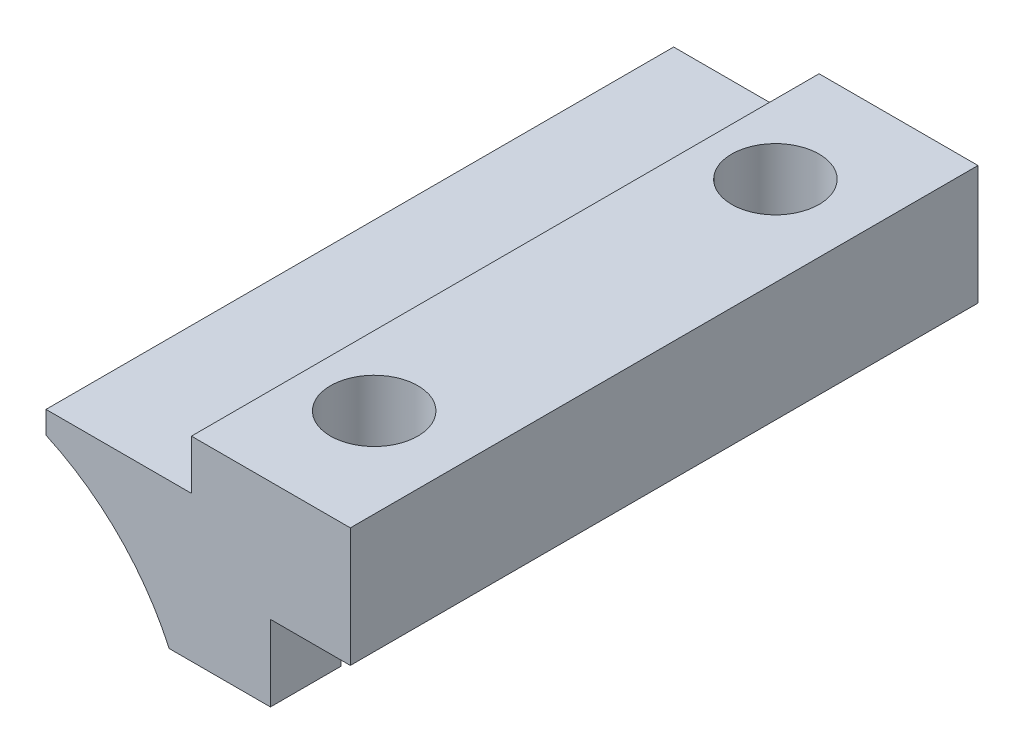
ISO-10303-21;
HEADER;
FILE_DESCRIPTION(('STEP AP214'),'2;1');
FILE_NAME('part.step','',(''),(''),'','','');
FILE_SCHEMA(('AUTOMOTIVE_DESIGN { 1 0 10303 214 1 1 1 1 }'));
ENDSEC;
DATA;
#1=APPLICATION_CONTEXT('core data for automotive mechanical design processes');
#2=APPLICATION_PROTOCOL_DEFINITION('international standard','automotive_design',2000,#1);
#3=PRODUCT_CONTEXT('',#1,'mechanical');
#4=PRODUCT('Part','Part','',(#3));
#5=PRODUCT_RELATED_PRODUCT_CATEGORY('part','',(#4));
#6=PRODUCT_DEFINITION_FORMATION('','',#4);
#7=PRODUCT_DEFINITION_CONTEXT('part definition',#1,'design');
#8=PRODUCT_DEFINITION('design','',#6,#7);
#9=PRODUCT_DEFINITION_SHAPE('','',#8);
#10=(LENGTH_UNIT() NAMED_UNIT(*) SI_UNIT(.MILLI.,.METRE.));
#11=(NAMED_UNIT(*) PLANE_ANGLE_UNIT() SI_UNIT($,.RADIAN.));
#12=(NAMED_UNIT(*) SI_UNIT($,.STERADIAN.) SOLID_ANGLE_UNIT());
#13=UNCERTAINTY_MEASURE_WITH_UNIT(LENGTH_MEASURE(1.E-05),#10,'distance_accuracy_value','');
#14=(GEOMETRIC_REPRESENTATION_CONTEXT(3) GLOBAL_UNCERTAINTY_ASSIGNED_CONTEXT((#13)) GLOBAL_UNIT_ASSIGNED_CONTEXT((#10,
#11,#12)) REPRESENTATION_CONTEXT('',''));
#15=CARTESIAN_POINT('',(0.,0.,0.));
#16=DIRECTION('',(0.,0.,1.));
#17=DIRECTION('',(1.,0.,0.));
#18=AXIS2_PLACEMENT_3D('',#15,#16,#17);
#19=CARTESIAN_POINT('',(12.5,6.25,-31.5));
#20=DIRECTION('',(-1.,0.,0.));
#21=DIRECTION('',(0.,0.,1.));
#22=AXIS2_PLACEMENT_3D('',#19,#20,#21);
#23=PLANE('',#22);
#24=DIRECTION('',(0.,0.,-1.));
#25=VECTOR('',#24,1.);
#26=CARTESIAN_POINT('',(12.5,12.5047262531089,-31.5));
#27=LINE('',#26,#25);
#28=CARTESIAN_POINT('',(12.5,12.5047262531089,0.600000000000004));
#29=VERTEX_POINT('',#28);
#30=CARTESIAN_POINT('',(12.5,12.5047262531089,-31.));
#31=VERTEX_POINT('',#30);
#32=EDGE_CURVE('E231',#29,#31,#27,.T.);
#33=ORIENTED_EDGE('',*,*,#32,.F.);
#34=DIRECTION('',(0.,1.,0.));
#35=VECTOR('',#34,1.);
#36=CARTESIAN_POINT('',(12.5,6.25,0.600000000000003));
#37=LINE('',#36,#35);
#38=CARTESIAN_POINT('',(12.5,15.,0.600000000000001));
#39=VERTEX_POINT('',#38);
#40=EDGE_CURVE('E209',#29,#39,#37,.T.);
#41=ORIENTED_EDGE('',*,*,#40,.T.);
#42=DIRECTION('',(0.,0.,1.));
#43=VECTOR('',#42,1.);
#44=CARTESIAN_POINT('',(12.5,15.,-31.5));
#45=LINE('',#44,#43);
#46=CARTESIAN_POINT('',(12.5,15.,-31.));
#47=VERTEX_POINT('',#46);
#48=EDGE_CURVE('E273',#47,#39,#45,.T.);
#49=ORIENTED_EDGE('',*,*,#48,.F.);
#50=DIRECTION('',(0.,1.,0.));
#51=VECTOR('',#50,1.);
#52=CARTESIAN_POINT('',(12.5,6.25,-31.));
#53=LINE('',#52,#51);
#54=EDGE_CURVE('E198',#31,#47,#53,.T.);
#55=ORIENTED_EDGE('',*,*,#54,.F.);
#56=EDGE_LOOP('',(#33,#41,#49,#55));
#57=FACE_BOUND('',#56,.T.);
#58=ADVANCED_FACE('F50',(#57),#23,.T.);
#59=CARTESIAN_POINT('',(20.5,6.25,-1.5));
#60=DIRECTION('',(1.,0.,0.));
#61=DIRECTION('',(0.,0.,-1.));
#62=AXIS2_PLACEMENT_3D('',#59,#60,#61);
#63=PLANE('',#62);
#64=DIRECTION('',(0.,0.,1.));
#65=VECTOR('',#64,1.);
#66=CARTESIAN_POINT('',(20.5,9.,-31.001));
#67=LINE('',#66,#65);
#68=CARTESIAN_POINT('',(20.5,9.,-31.));
#69=VERTEX_POINT('',#68);
#70=CARTESIAN_POINT('',(20.5,9.,0.599999999999999));
#71=VERTEX_POINT('',#70);
#72=EDGE_CURVE('E144',#69,#71,#67,.T.);
#73=ORIENTED_EDGE('',*,*,#72,.F.);
#74=DIRECTION('',(0.,1.,0.));
#75=VECTOR('',#74,1.);
#76=CARTESIAN_POINT('',(20.5,0.,-31.));
#77=LINE('',#76,#75);
#78=CARTESIAN_POINT('',(20.5,15.,-31.));
#79=VERTEX_POINT('',#78);
#80=EDGE_CURVE('E175',#69,#79,#77,.T.);
#81=ORIENTED_EDGE('',*,*,#80,.T.);
#82=DIRECTION('',(0.,0.,-1.));
#83=VECTOR('',#82,1.);
#84=CARTESIAN_POINT('',(20.5,15.,-1.5));
#85=LINE('',#84,#83);
#86=CARTESIAN_POINT('',(20.5,15.,0.600000000000002));
#87=VERTEX_POINT('',#86);
#88=EDGE_CURVE('E168',#87,#79,#85,.T.);
#89=ORIENTED_EDGE('',*,*,#88,.F.);
#90=DIRECTION('',(0.,1.,0.));
#91=VECTOR('',#90,1.);
#92=CARTESIAN_POINT('',(20.5,0.,0.600000000000002));
#93=LINE('',#92,#91);
#94=EDGE_CURVE('E159',#71,#87,#93,.T.);
#95=ORIENTED_EDGE('',*,*,#94,.F.);
#96=EDGE_LOOP('',(#73,#81,#89,#95));
#97=FACE_BOUND('',#96,.T.);
#98=ADVANCED_FACE('F166',(#97),#63,.T.);
#99=CARTESIAN_POINT('',(0.,15.,0.));
#100=DIRECTION('',(0.,1.,0.));
#101=DIRECTION('',(0.,0.,1.));
#102=AXIS2_PLACEMENT_3D('',#99,#100,#101);
#103=PLANE('',#102);
#104=CARTESIAN_POINT('',(16.,15.,-5.10000984037937));
#105=DIRECTION('',(0.,1.,0.));
#106=DIRECTION('',(0.,0.,1.));
#107=AXIS2_PLACEMENT_3D('',#104,#105,#106);
#108=CIRCLE('',#107,2.2);
#109=CARTESIAN_POINT('',(16.,15.,-2.90000984037937));
#110=VERTEX_POINT('',#109);
#111=EDGE_CURVE('E187',#110,#110,#108,.T.);
#112=ORIENTED_EDGE('',*,*,#111,.F.);
#113=EDGE_LOOP('',(#112));
#114=FACE_BOUND('',#113,.T.);
#115=CARTESIAN_POINT('',(16.,15.,-25.3));
#116=DIRECTION('',(0.,1.,0.));
#117=DIRECTION('',(0.,0.,1.));
#118=AXIS2_PLACEMENT_3D('',#115,#116,#117);
#119=CIRCLE('',#118,2.2);
#120=CARTESIAN_POINT('',(16.,15.,-23.1));
#121=VERTEX_POINT('',#120);
#122=EDGE_CURVE('E182',#121,#121,#119,.T.);
#123=ORIENTED_EDGE('',*,*,#122,.F.);
#124=EDGE_LOOP('',(#123));
#125=FACE_BOUND('',#124,.T.);
#126=ORIENTED_EDGE('',*,*,#48,.T.);
#127=DIRECTION('',(1.,0.,0.));
#128=VECTOR('',#127,1.);
#129=CARTESIAN_POINT('',(5.17766952966376,15.,0.6));
#130=LINE('',#129,#128);
#131=EDGE_CURVE('E170',#39,#87,#130,.T.);
#132=ORIENTED_EDGE('',*,*,#131,.T.);
#133=ORIENTED_EDGE('',*,*,#88,.T.);
#134=DIRECTION('',(1.,0.,0.));
#135=VECTOR('',#134,1.);
#136=CARTESIAN_POINT('',(5.17766952966376,15.,-31.));
#137=LINE('',#136,#135);
#138=EDGE_CURVE('E336',#47,#79,#137,.T.);
#139=ORIENTED_EDGE('',*,*,#138,.F.);
#140=EDGE_LOOP('',(#126,#132,#133,#139));
#141=FACE_BOUND('',#140,.T.);
#142=ADVANCED_FACE('F351',(#114,#125,#141),#103,.T.);
#143=CARTESIAN_POINT('',(16.4772465140557,5.17766952966369,-1.5));
#144=DIRECTION('',(-1.,0.,0.));
#145=DIRECTION('',(0.,0.,1.));
#146=AXIS2_PLACEMENT_3D('',#143,#144,#145);
#147=PLANE('',#146);
#148=DIRECTION('',(0.,1.,0.));
#149=VECTOR('',#148,1.);
#150=CARTESIAN_POINT('',(16.4772465140557,5.17766952966369,0.600000000000001));
#151=LINE('',#150,#149);
#152=CARTESIAN_POINT('',(16.4772465140557,5.17766952966369,0.600000000000001));
#153=VERTEX_POINT('',#152);
#154=CARTESIAN_POINT('',(16.4772465140557,9.,0.599999999999999));
#155=VERTEX_POINT('',#154);
#156=EDGE_CURVE('E162',#153,#155,#151,.T.);
#157=ORIENTED_EDGE('',*,*,#156,.F.);
#158=DIRECTION('',(0.,0.,1.));
#159=VECTOR('',#158,1.);
#160=CARTESIAN_POINT('',(16.4772465140557,5.17766952966369,-1.5));
#161=LINE('',#160,#159);
#162=CARTESIAN_POINT('',(16.4772465140557,5.17766952966369,-2.95239819838688));
#163=VERTEX_POINT('',#162);
#164=EDGE_CURVE('E239',#163,#153,#161,.T.);
#165=ORIENTED_EDGE('',*,*,#164,.F.);
#166=DIRECTION('',(0.,1.,0.));
#167=VECTOR('',#166,1.);
#168=CARTESIAN_POINT('',(16.4772465140557,0.,-2.95239819838688));
#169=LINE('',#168,#167);
#170=CARTESIAN_POINT('',(16.4772465140557,9.,-2.95239819838688));
#171=VERTEX_POINT('',#170);
#172=EDGE_CURVE('E65',#163,#171,#169,.T.);
#173=ORIENTED_EDGE('',*,*,#172,.T.);
#174=DIRECTION('',(0.,0.,1.));
#175=VECTOR('',#174,1.);
#176=CARTESIAN_POINT('',(16.4772465140557,9.,-31.001));
#177=LINE('',#176,#175);
#178=EDGE_CURVE('E155',#171,#155,#177,.T.);
#179=ORIENTED_EDGE('',*,*,#178,.T.);
#180=EDGE_LOOP('',(#157,#165,#173,#179));
#181=FACE_BOUND('',#180,.T.);
#182=ADVANCED_FACE('F307',(#181),#147,.F.);
#183=DIRECTION('',(0.,1.,0.));
#184=VECTOR('',#183,1.);
#185=CARTESIAN_POINT('',(16.4772465140557,0.,-23.1523883580075));
#186=LINE('',#185,#184);
#187=CARTESIAN_POINT('',(16.4772465140557,5.17766952966369,-23.1523883580075));
#188=VERTEX_POINT('',#187);
#189=CARTESIAN_POINT('',(16.4772465140557,9.,-23.1523883580075));
#190=VERTEX_POINT('',#189);
#191=EDGE_CURVE('E217',#188,#190,#186,.T.);
#192=ORIENTED_EDGE('',*,*,#191,.T.);
#193=CARTESIAN_POINT('',(16.4772465140557,9.,-7.24762148237187));
#194=VERTEX_POINT('',#193);
#195=EDGE_CURVE('E310',#190,#194,#177,.T.);
#196=ORIENTED_EDGE('',*,*,#195,.T.);
#197=DIRECTION('',(0.,1.,0.));
#198=VECTOR('',#197,1.);
#199=CARTESIAN_POINT('',(16.4772465140557,0.,-7.24762148237187));
#200=LINE('',#199,#198);
#201=CARTESIAN_POINT('',(16.4772465140557,5.17766952966369,-7.24762148237187));
#202=VERTEX_POINT('',#201);
#203=EDGE_CURVE('E220',#194,#202,#200,.F.);
#204=ORIENTED_EDGE('',*,*,#203,.T.);
#205=EDGE_CURVE('E295',#188,#202,#161,.T.);
#206=ORIENTED_EDGE('',*,*,#205,.F.);
#207=EDGE_LOOP('',(#192,#196,#204,#206));
#208=FACE_BOUND('',#207,.T.);
#209=ADVANCED_FACE('F299',(#208),#147,.F.);
#210=CARTESIAN_POINT('',(0.,5.17766952966369,0.));
#211=DIRECTION('',(0.,1.,0.));
#212=DIRECTION('',(0.,0.,1.));
#213=AXIS2_PLACEMENT_3D('',#210,#211,#212);
#214=PLANE('',#213);
#215=DIRECTION('',(1.,0.,0.));
#216=VECTOR('',#215,1.);
#217=CARTESIAN_POINT('',(0.,5.17766952966369,0.599999999999999));
#218=LINE('',#217,#216);
#219=CARTESIAN_POINT('',(11.3772465140557,5.17766952966368,0.600000000000005));
#220=VERTEX_POINT('',#219);
#221=EDGE_CURVE('E201',#220,#153,#218,.T.);
#222=ORIENTED_EDGE('',*,*,#221,.F.);
#223=DIRECTION('',(0.,0.,1.));
#224=VECTOR('',#223,1.);
#225=CARTESIAN_POINT('',(11.3772465140557,5.17766952966369,-31.5));
#226=LINE('',#225,#224);
#227=CARTESIAN_POINT('',(11.3772465140557,5.17766952966369,-31.));
#228=VERTEX_POINT('',#227);
#229=EDGE_CURVE('E226',#228,#220,#226,.T.);
#230=ORIENTED_EDGE('',*,*,#229,.F.);
#231=DIRECTION('',(1.,0.,0.));
#232=VECTOR('',#231,1.);
#233=CARTESIAN_POINT('',(0.,5.17766952966369,-31.));
#234=LINE('',#233,#232);
#235=CARTESIAN_POINT('',(16.4772465140557,5.17766952966369,-31.));
#236=VERTEX_POINT('',#235);
#237=EDGE_CURVE('E186',#228,#236,#234,.T.);
#238=ORIENTED_EDGE('',*,*,#237,.T.);
#239=CARTESIAN_POINT('',(16.4772465140557,5.17766952966369,-27.4476116419925));
#240=VERTEX_POINT('',#239);
#241=EDGE_CURVE('E278',#236,#240,#161,.T.);
#242=ORIENTED_EDGE('',*,*,#241,.T.);
#243=CARTESIAN_POINT('',(16.,5.17766952966369,-25.3));
#244=DIRECTION('',(0.,1.,0.));
#245=DIRECTION('',(0.,0.,1.));
#246=AXIS2_PLACEMENT_3D('',#243,#244,#245);
#247=CIRCLE('',#246,2.2);
#248=EDGE_CURVE('E58',#240,#188,#247,.T.);
#249=ORIENTED_EDGE('',*,*,#248,.T.);
#250=ORIENTED_EDGE('',*,*,#205,.T.);
#251=CARTESIAN_POINT('',(16.,5.17766952966369,-5.10000984037937));
#252=DIRECTION('',(0.,1.,0.));
#253=DIRECTION('',(0.,0.,1.));
#254=AXIS2_PLACEMENT_3D('',#251,#252,#253);
#255=CIRCLE('',#254,2.2);
#256=EDGE_CURVE('E12',#202,#163,#255,.T.);
#257=ORIENTED_EDGE('',*,*,#256,.T.);
#258=ORIENTED_EDGE('',*,*,#164,.T.);
#259=EDGE_LOOP('',(#222,#230,#238,#242,#249,#250,#257,#258));
#260=FACE_BOUND('',#259,.T.);
#261=ADVANCED_FACE('F294',(#260),#214,.F.);
#262=CARTESIAN_POINT('',(5.17766952966376,12.5047262531089,-31.5));
#263=DIRECTION('',(0.,-1.,0.));
#264=DIRECTION('',(0.,0.,-1.));
#265=AXIS2_PLACEMENT_3D('',#262,#263,#264);
#266=PLANE('',#265);
#267=DIRECTION('',(-1.,0.,0.));
#268=VECTOR('',#267,1.);
#269=CARTESIAN_POINT('',(5.17766952966376,12.5047262531089,0.600000000000003));
#270=LINE('',#269,#268);
#271=CARTESIAN_POINT('',(5.17766952966376,12.5047262531089,0.6));
#272=VERTEX_POINT('',#271);
#273=EDGE_CURVE('E206',#29,#272,#270,.T.);
#274=ORIENTED_EDGE('',*,*,#273,.F.);
#275=ORIENTED_EDGE('',*,*,#32,.T.);
#276=DIRECTION('',(-1.,0.,0.));
#277=VECTOR('',#276,1.);
#278=CARTESIAN_POINT('',(5.17766952966376,12.5047262531089,-31.));
#279=LINE('',#278,#277);
#280=CARTESIAN_POINT('',(5.17766952966376,12.5047262531089,-31.));
#281=VERTEX_POINT('',#280);
#282=EDGE_CURVE('E194',#31,#281,#279,.T.);
#283=ORIENTED_EDGE('',*,*,#282,.T.);
#284=DIRECTION('',(0.,0.,-1.));
#285=VECTOR('',#284,1.);
#286=CARTESIAN_POINT('',(5.17766952966376,12.5047262531089,-31.5));
#287=LINE('',#286,#285);
#288=EDGE_CURVE('E235',#272,#281,#287,.T.);
#289=ORIENTED_EDGE('',*,*,#288,.F.);
#290=EDGE_LOOP('',(#274,#275,#283,#289));
#291=FACE_BOUND('',#290,.T.);
#292=ADVANCED_FACE('F356',(#291),#266,.F.);
#293=CARTESIAN_POINT('',(5.17766952966376,0.,0.));
#294=DIRECTION('',(1.,0.,0.));
#295=DIRECTION('',(0.,0.,-1.));
#296=AXIS2_PLACEMENT_3D('',#293,#294,#295);
#297=PLANE('',#296);
#298=DIRECTION('',(0.,1.,0.));
#299=VECTOR('',#298,1.);
#300=CARTESIAN_POINT('',(5.17766952966376,0.,0.6));
#301=LINE('',#300,#299);
#302=CARTESIAN_POINT('',(5.17766952966374,11.3772465140557,0.600000000000003));
#303=VERTEX_POINT('',#302);
#304=EDGE_CURVE('E171',#303,#272,#301,.T.);
#305=ORIENTED_EDGE('',*,*,#304,.T.);
#306=ORIENTED_EDGE('',*,*,#288,.T.);
#307=DIRECTION('',(0.,1.,0.));
#308=VECTOR('',#307,1.);
#309=CARTESIAN_POINT('',(5.17766952966376,0.,-31.));
#310=LINE('',#309,#308);
#311=CARTESIAN_POINT('',(5.17766952966376,11.3772465140557,-31.));
#312=VERTEX_POINT('',#311);
#313=EDGE_CURVE('E340',#312,#281,#310,.T.);
#314=ORIENTED_EDGE('',*,*,#313,.F.);
#315=DIRECTION('',(0.,0.,1.));
#316=VECTOR('',#315,1.);
#317=CARTESIAN_POINT('',(5.17766952966374,11.3772465140557,-31.5));
#318=LINE('',#317,#316);
#319=EDGE_CURVE('E227',#312,#303,#318,.T.);
#320=ORIENTED_EDGE('',*,*,#319,.T.);
#321=EDGE_LOOP('',(#305,#306,#314,#320));
#322=FACE_BOUND('',#321,.T.);
#323=ADVANCED_FACE('F360',(#322),#297,.F.);
#324=CARTESIAN_POINT('',(0.,0.,-31.5));
#325=DIRECTION('',(0.,0.,1.));
#326=DIRECTION('',(1.,0.,0.));
#327=AXIS2_PLACEMENT_3D('',#324,#325,#326);
#328=CYLINDRICAL_SURFACE('',#327,12.5);
#329=CARTESIAN_POINT('',(0.,0.,0.600000000000003));
#330=DIRECTION('',(0.,0.,1.));
#331=DIRECTION('',(1.,0.,0.));
#332=AXIS2_PLACEMENT_3D('',#329,#330,#331);
#333=CIRCLE('',#332,12.5);
#334=EDGE_CURVE('E285',#303,#220,#333,.F.);
#335=ORIENTED_EDGE('',*,*,#334,.F.);
#336=ORIENTED_EDGE('',*,*,#319,.F.);
#337=CARTESIAN_POINT('',(0.,0.,-31.));
#338=DIRECTION('',(0.,0.,1.));
#339=DIRECTION('',(1.,0.,0.));
#340=AXIS2_PLACEMENT_3D('',#337,#338,#339);
#341=CIRCLE('',#340,12.5);
#342=EDGE_CURVE('E281',#312,#228,#341,.F.);
#343=ORIENTED_EDGE('',*,*,#342,.T.);
#344=ORIENTED_EDGE('',*,*,#229,.T.);
#345=EDGE_LOOP('',(#335,#336,#343,#344));
#346=FACE_BOUND('',#345,.T.);
#347=ADVANCED_FACE('F364',(#346),#328,.F.);
#348=ORIENTED_EDGE('',*,*,#241,.F.);
#349=DIRECTION('',(0.,1.,0.));
#350=VECTOR('',#349,1.);
#351=CARTESIAN_POINT('',(16.4772465140557,5.17766952966369,-31.));
#352=LINE('',#351,#350);
#353=CARTESIAN_POINT('',(16.4772465140557,9.,-31.));
#354=VERTEX_POINT('',#353);
#355=EDGE_CURVE('E191',#236,#354,#352,.T.);
#356=ORIENTED_EDGE('',*,*,#355,.T.);
#357=CARTESIAN_POINT('',(16.4772465140557,9.,-27.4476116419925));
#358=VERTEX_POINT('',#357);
#359=EDGE_CURVE('E178',#354,#358,#177,.T.);
#360=ORIENTED_EDGE('',*,*,#359,.T.);
#361=DIRECTION('',(0.,1.,0.));
#362=VECTOR('',#361,1.);
#363=CARTESIAN_POINT('',(16.4772465140557,0.,-27.4476116419925));
#364=LINE('',#363,#362);
#365=EDGE_CURVE('E213',#358,#240,#364,.F.);
#366=ORIENTED_EDGE('',*,*,#365,.T.);
#367=EDGE_LOOP('',(#348,#356,#360,#366));
#368=FACE_BOUND('',#367,.T.);
#369=ADVANCED_FACE('F317',(#368),#147,.F.);
#370=CARTESIAN_POINT('',(5.17766952966376,0.,-31.));
#371=DIRECTION('',(0.,0.,1.));
#372=DIRECTION('',(1.,0.,0.));
#373=AXIS2_PLACEMENT_3D('',#370,#371,#372);
#374=PLANE('',#373);
#375=DIRECTION('',(1.,0.,0.));
#376=VECTOR('',#375,1.);
#377=CARTESIAN_POINT('',(16.4772465140557,9.,-31.));
#378=LINE('',#377,#376);
#379=EDGE_CURVE('E150',#354,#69,#378,.T.);
#380=ORIENTED_EDGE('',*,*,#379,.F.);
#381=ORIENTED_EDGE('',*,*,#355,.F.);
#382=ORIENTED_EDGE('',*,*,#237,.F.);
#383=ORIENTED_EDGE('',*,*,#342,.F.);
#384=ORIENTED_EDGE('',*,*,#313,.T.);
#385=ORIENTED_EDGE('',*,*,#282,.F.);
#386=ORIENTED_EDGE('',*,*,#54,.T.);
#387=ORIENTED_EDGE('',*,*,#138,.T.);
#388=ORIENTED_EDGE('',*,*,#80,.F.);
#389=EDGE_LOOP('',(#380,#381,#382,#383,#384,#385,#386,#387,#388));
#390=FACE_BOUND('',#389,.T.);
#391=ADVANCED_FACE('F347',(#390),#374,.F.);
#392=CARTESIAN_POINT('',(5.17766952966376,0.,0.6));
#393=DIRECTION('',(0.,0.,1.));
#394=DIRECTION('',(1.,0.,0.));
#395=AXIS2_PLACEMENT_3D('',#392,#393,#394);
#396=PLANE('',#395);
#397=ORIENTED_EDGE('',*,*,#156,.T.);
#398=DIRECTION('',(-1.,0.,0.));
#399=VECTOR('',#398,1.);
#400=CARTESIAN_POINT('',(16.4772465140557,9.,0.599999999999999));
#401=LINE('',#400,#399);
#402=EDGE_CURVE('E147',#71,#155,#401,.T.);
#403=ORIENTED_EDGE('',*,*,#402,.F.);
#404=ORIENTED_EDGE('',*,*,#94,.T.);
#405=ORIENTED_EDGE('',*,*,#131,.F.);
#406=ORIENTED_EDGE('',*,*,#40,.F.);
#407=ORIENTED_EDGE('',*,*,#273,.T.);
#408=ORIENTED_EDGE('',*,*,#304,.F.);
#409=ORIENTED_EDGE('',*,*,#334,.T.);
#410=ORIENTED_EDGE('',*,*,#221,.T.);
#411=EDGE_LOOP('',(#397,#403,#404,#405,#406,#407,#408,#409,#410));
#412=FACE_BOUND('',#411,.T.);
#413=ADVANCED_FACE('F158',(#412),#396,.T.);
#414=CARTESIAN_POINT('',(16.,0.,-25.3));
#415=DIRECTION('',(0.,1.,0.));
#416=DIRECTION('',(0.,0.,1.));
#417=AXIS2_PLACEMENT_3D('',#414,#415,#416);
#418=CYLINDRICAL_SURFACE('',#417,2.2);
#419=ORIENTED_EDGE('',*,*,#365,.F.);
#420=CARTESIAN_POINT('',(16.,9.,-25.3));
#421=DIRECTION('',(0.,1.,0.));
#422=DIRECTION('',(0.,0.,1.));
#423=AXIS2_PLACEMENT_3D('',#420,#421,#422);
#424=CIRCLE('',#423,2.2);
#425=EDGE_CURVE('E319',#190,#358,#424,.T.);
#426=ORIENTED_EDGE('',*,*,#425,.F.);
#427=ORIENTED_EDGE('',*,*,#191,.F.);
#428=ORIENTED_EDGE('',*,*,#248,.F.);
#429=EDGE_LOOP('',(#419,#426,#427,#428));
#430=FACE_BOUND('',#429,.T.);
#431=ORIENTED_EDGE('',*,*,#122,.T.);
#432=EDGE_LOOP('',(#431));
#433=FACE_BOUND('',#432,.T.);
#434=ADVANCED_FACE('F330',(#430,#433),#418,.F.);
#435=CARTESIAN_POINT('',(16.,0.,-5.10000984037937));
#436=DIRECTION('',(0.,1.,0.));
#437=DIRECTION('',(0.,0.,1.));
#438=AXIS2_PLACEMENT_3D('',#435,#436,#437);
#439=CYLINDRICAL_SURFACE('',#438,2.2);
#440=ORIENTED_EDGE('',*,*,#203,.F.);
#441=CARTESIAN_POINT('',(16.,9.,-5.10000984037937));
#442=DIRECTION('',(0.,1.,0.));
#443=DIRECTION('',(0.,0.,1.));
#444=AXIS2_PLACEMENT_3D('',#441,#442,#443);
#445=CIRCLE('',#444,2.2);
#446=EDGE_CURVE('E321',#171,#194,#445,.T.);
#447=ORIENTED_EDGE('',*,*,#446,.F.);
#448=ORIENTED_EDGE('',*,*,#172,.F.);
#449=ORIENTED_EDGE('',*,*,#256,.F.);
#450=EDGE_LOOP('',(#440,#447,#448,#449));
#451=FACE_BOUND('',#450,.T.);
#452=ORIENTED_EDGE('',*,*,#111,.T.);
#453=EDGE_LOOP('',(#452));
#454=FACE_BOUND('',#453,.T.);
#455=ADVANCED_FACE('F327',(#451,#454),#439,.F.);
#456=CARTESIAN_POINT('',(16.4772465140557,9.,-31.001));
#457=DIRECTION('',(0.,1.,0.));
#458=DIRECTION('',(0.,0.,1.));
#459=AXIS2_PLACEMENT_3D('',#456,#457,#458);
#460=PLANE('',#459);
#461=ORIENTED_EDGE('',*,*,#379,.T.);
#462=ORIENTED_EDGE('',*,*,#72,.T.);
#463=ORIENTED_EDGE('',*,*,#402,.T.);
#464=ORIENTED_EDGE('',*,*,#178,.F.);
#465=ORIENTED_EDGE('',*,*,#446,.T.);
#466=ORIENTED_EDGE('',*,*,#195,.F.);
#467=ORIENTED_EDGE('',*,*,#425,.T.);
#468=ORIENTED_EDGE('',*,*,#359,.F.);
#469=EDGE_LOOP('',(#461,#462,#463,#464,#465,#466,#467,#468));
#470=FACE_BOUND('',#469,.T.);
#471=ADVANCED_FACE('F146',(#470),#460,.F.);
#472=CLOSED_SHELL('',(#58,#98,#142,#182,#209,#261,#292,#323,#347,#369,#391,#413,#434,#455,#471));
#473=MANIFOLD_SOLID_BREP('B2',#472);
#474=ADVANCED_BREP_SHAPE_REPRESENTATION('',(#18,#473),#14);
#475=SHAPE_DEFINITION_REPRESENTATION(#9,#474);
ENDSEC;
END-ISO-10303-21;
